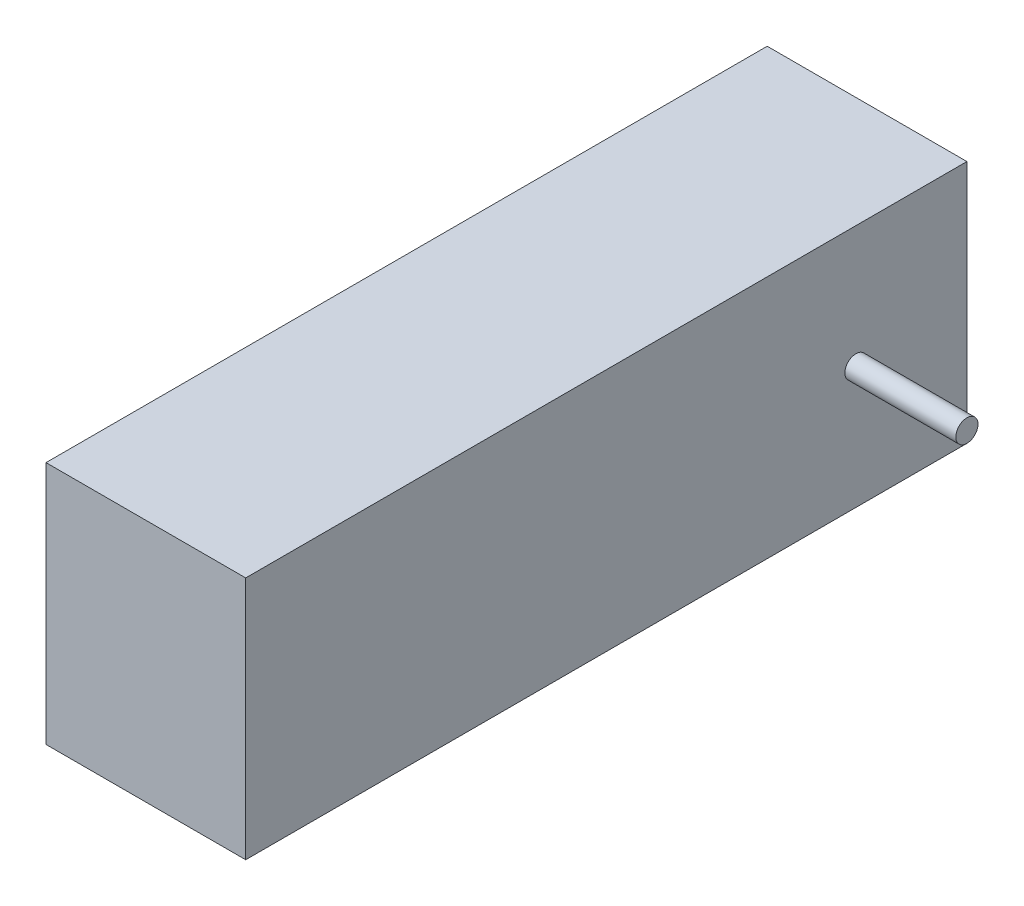
ISO-10303-21;
HEADER;
FILE_DESCRIPTION(('STEP AP214'),'2;1');
FILE_NAME('part.step','',(''),(''),'','','');
FILE_SCHEMA(('AUTOMOTIVE_DESIGN { 1 0 10303 214 1 1 1 1 }'));
ENDSEC;
DATA;
#1=APPLICATION_CONTEXT('core data for automotive mechanical design processes');
#2=APPLICATION_PROTOCOL_DEFINITION('international standard','automotive_design',2000,#1);
#3=PRODUCT_CONTEXT('',#1,'mechanical');
#4=PRODUCT('Part','Part','',(#3));
#5=PRODUCT_RELATED_PRODUCT_CATEGORY('part','',(#4));
#6=PRODUCT_DEFINITION_FORMATION('','',#4);
#7=PRODUCT_DEFINITION_CONTEXT('part definition',#1,'design');
#8=PRODUCT_DEFINITION('design','',#6,#7);
#9=PRODUCT_DEFINITION_SHAPE('','',#8);
#10=(LENGTH_UNIT() NAMED_UNIT(*) SI_UNIT(.MILLI.,.METRE.));
#11=(NAMED_UNIT(*) PLANE_ANGLE_UNIT() SI_UNIT($,.RADIAN.));
#12=(NAMED_UNIT(*) SI_UNIT($,.STERADIAN.) SOLID_ANGLE_UNIT());
#13=UNCERTAINTY_MEASURE_WITH_UNIT(LENGTH_MEASURE(1.E-05),#10,'distance_accuracy_value','');
#14=(GEOMETRIC_REPRESENTATION_CONTEXT(3) GLOBAL_UNCERTAINTY_ASSIGNED_CONTEXT((#13)) GLOBAL_UNIT_ASSIGNED_CONTEXT((#10,
#11,#12)) REPRESENTATION_CONTEXT('',''));
#15=CARTESIAN_POINT('',(0.,0.,0.));
#16=DIRECTION('',(0.,0.,1.));
#17=DIRECTION('',(1.,0.,0.));
#18=AXIS2_PLACEMENT_3D('',#15,#16,#17);
#19=CARTESIAN_POINT('',(-9.,11.,65.));
#20=DIRECTION('',(1.,0.,0.));
#21=DIRECTION('',(0.,1.,0.));
#22=AXIS2_PLACEMENT_3D('',#19,#20,#21);
#23=PLANE('',#22);
#24=CARTESIAN_POINT('',(-9.,0.,10.));
#25=DIRECTION('',(1.,0.,0.));
#26=DIRECTION('',(0.,1.,0.));
#27=AXIS2_PLACEMENT_3D('',#24,#25,#26);
#28=CIRCLE('',#27,1.);
#29=CARTESIAN_POINT('',(-9.,0.999999999999998,10.));
#30=VERTEX_POINT('',#29);
#31=EDGE_CURVE('E100',#30,#30,#28,.T.);
#32=ORIENTED_EDGE('',*,*,#31,.T.);
#33=EDGE_LOOP('',(#32));
#34=FACE_BOUND('',#33,.T.);
#35=DIRECTION('',(0.,-1.,0.));
#36=VECTOR('',#35,1.);
#37=CARTESIAN_POINT('',(-9.,11.,0.));
#38=LINE('',#37,#36);
#39=CARTESIAN_POINT('',(-9.,11.,0.));
#40=VERTEX_POINT('',#39);
#41=CARTESIAN_POINT('',(-8.99999999999999,-11.,0.));
#42=VERTEX_POINT('',#41);
#43=EDGE_CURVE('E97',#40,#42,#38,.T.);
#44=ORIENTED_EDGE('',*,*,#43,.T.);
#45=DIRECTION('',(0.,0.,-1.));
#46=VECTOR('',#45,1.);
#47=CARTESIAN_POINT('',(-8.99999999999999,-11.,65.));
#48=LINE('',#47,#46);
#49=CARTESIAN_POINT('',(-8.99999999999999,-11.,65.));
#50=VERTEX_POINT('',#49);
#51=EDGE_CURVE('E11',#50,#42,#48,.T.);
#52=ORIENTED_EDGE('',*,*,#51,.F.);
#53=DIRECTION('',(0.,-1.,0.));
#54=VECTOR('',#53,1.);
#55=CARTESIAN_POINT('',(-9.,11.,65.));
#56=LINE('',#55,#54);
#57=CARTESIAN_POINT('',(-9.,11.,65.));
#58=VERTEX_POINT('',#57);
#59=EDGE_CURVE('E84',#58,#50,#56,.T.);
#60=ORIENTED_EDGE('',*,*,#59,.F.);
#61=DIRECTION('',(0.,0.,-1.));
#62=VECTOR('',#61,1.);
#63=CARTESIAN_POINT('',(-9.,11.,65.));
#64=LINE('',#63,#62);
#65=EDGE_CURVE('E93',#58,#40,#64,.T.);
#66=ORIENTED_EDGE('',*,*,#65,.T.);
#67=EDGE_LOOP('',(#44,#52,#60,#66));
#68=FACE_BOUND('',#67,.T.);
#69=ADVANCED_FACE('F32',(#34,#68),#23,.F.);
#70=CARTESIAN_POINT('',(9.,-11.,65.));
#71=DIRECTION('',(0.,1.,0.));
#72=DIRECTION('',(-1.,0.,0.));
#73=AXIS2_PLACEMENT_3D('',#70,#71,#72);
#74=PLANE('',#73);
#75=DIRECTION('',(1.,0.,0.));
#76=VECTOR('',#75,1.);
#77=CARTESIAN_POINT('',(9.,-11.,0.));
#78=LINE('',#77,#76);
#79=CARTESIAN_POINT('',(9.,-11.,0.));
#80=VERTEX_POINT('',#79);
#81=EDGE_CURVE('E88',#42,#80,#78,.T.);
#82=ORIENTED_EDGE('',*,*,#81,.T.);
#83=DIRECTION('',(0.,0.,-1.));
#84=VECTOR('',#83,1.);
#85=CARTESIAN_POINT('',(9.,-11.,65.));
#86=LINE('',#85,#84);
#87=CARTESIAN_POINT('',(9.,-11.,65.));
#88=VERTEX_POINT('',#87);
#89=EDGE_CURVE('E41',#88,#80,#86,.T.);
#90=ORIENTED_EDGE('',*,*,#89,.F.);
#91=DIRECTION('',(1.,0.,0.));
#92=VECTOR('',#91,1.);
#93=CARTESIAN_POINT('',(9.,-11.,65.));
#94=LINE('',#93,#92);
#95=EDGE_CURVE('E79',#50,#88,#94,.T.);
#96=ORIENTED_EDGE('',*,*,#95,.F.);
#97=ORIENTED_EDGE('',*,*,#51,.T.);
#98=EDGE_LOOP('',(#82,#90,#96,#97));
#99=FACE_BOUND('',#98,.T.);
#100=ADVANCED_FACE('F87',(#99),#74,.F.);
#101=CARTESIAN_POINT('',(9.,11.,65.));
#102=DIRECTION('',(-1.,0.,0.));
#103=DIRECTION('',(0.,-1.,0.));
#104=AXIS2_PLACEMENT_3D('',#101,#102,#103);
#105=PLANE('',#104);
#106=CARTESIAN_POINT('',(9.,0.,10.));
#107=DIRECTION('',(-1.,0.,0.));
#108=DIRECTION('',(0.,-1.,0.));
#109=AXIS2_PLACEMENT_3D('',#106,#107,#108);
#110=CIRCLE('',#109,1.);
#111=CARTESIAN_POINT('',(9.,-0.999999999999998,10.));
#112=VERTEX_POINT('',#111);
#113=EDGE_CURVE('E35',#112,#112,#110,.T.);
#114=ORIENTED_EDGE('',*,*,#113,.T.);
#115=EDGE_LOOP('',(#114));
#116=FACE_BOUND('',#115,.T.);
#117=DIRECTION('',(0.,1.,0.));
#118=VECTOR('',#117,1.);
#119=CARTESIAN_POINT('',(9.,11.,0.));
#120=LINE('',#119,#118);
#121=CARTESIAN_POINT('',(9.,11.,0.));
#122=VERTEX_POINT('',#121);
#123=EDGE_CURVE('E66',#80,#122,#120,.T.);
#124=ORIENTED_EDGE('',*,*,#123,.T.);
#125=DIRECTION('',(0.,0.,-1.));
#126=VECTOR('',#125,1.);
#127=CARTESIAN_POINT('',(9.,11.,65.));
#128=LINE('',#127,#126);
#129=CARTESIAN_POINT('',(9.,11.,65.));
#130=VERTEX_POINT('',#129);
#131=EDGE_CURVE('E89',#130,#122,#128,.T.);
#132=ORIENTED_EDGE('',*,*,#131,.F.);
#133=DIRECTION('',(0.,1.,0.));
#134=VECTOR('',#133,1.);
#135=CARTESIAN_POINT('',(9.,11.,65.));
#136=LINE('',#135,#134);
#137=EDGE_CURVE('E82',#88,#130,#136,.T.);
#138=ORIENTED_EDGE('',*,*,#137,.F.);
#139=ORIENTED_EDGE('',*,*,#89,.T.);
#140=EDGE_LOOP('',(#124,#132,#138,#139));
#141=FACE_BOUND('',#140,.T.);
#142=ADVANCED_FACE('F91',(#116,#141),#105,.F.);
#143=CARTESIAN_POINT('',(9.,11.,65.));
#144=DIRECTION('',(0.,-1.,0.));
#145=DIRECTION('',(0.,0.,-1.));
#146=AXIS2_PLACEMENT_3D('',#143,#144,#145);
#147=PLANE('',#146);
#148=DIRECTION('',(-1.,0.,0.));
#149=VECTOR('',#148,1.);
#150=CARTESIAN_POINT('',(9.,11.,0.));
#151=LINE('',#150,#149);
#152=EDGE_CURVE('E72',#122,#40,#151,.T.);
#153=ORIENTED_EDGE('',*,*,#152,.T.);
#154=ORIENTED_EDGE('',*,*,#65,.F.);
#155=DIRECTION('',(-1.,0.,0.));
#156=VECTOR('',#155,1.);
#157=CARTESIAN_POINT('',(9.,11.,65.));
#158=LINE('',#157,#156);
#159=EDGE_CURVE('E49',#130,#58,#158,.T.);
#160=ORIENTED_EDGE('',*,*,#159,.F.);
#161=ORIENTED_EDGE('',*,*,#131,.T.);
#162=EDGE_LOOP('',(#153,#154,#160,#161));
#163=FACE_BOUND('',#162,.T.);
#164=ADVANCED_FACE('F105',(#163),#147,.F.);
#165=CARTESIAN_POINT('',(0.,0.,65.));
#166=DIRECTION('',(0.,0.,-1.));
#167=DIRECTION('',(-1.,0.,0.));
#168=AXIS2_PLACEMENT_3D('',#165,#166,#167);
#169=PLANE('',#168);
#170=ORIENTED_EDGE('',*,*,#59,.T.);
#171=ORIENTED_EDGE('',*,*,#95,.T.);
#172=ORIENTED_EDGE('',*,*,#137,.T.);
#173=ORIENTED_EDGE('',*,*,#159,.T.);
#174=EDGE_LOOP('',(#170,#171,#172,#173));
#175=FACE_BOUND('',#174,.T.);
#176=ADVANCED_FACE('F80',(#175),#169,.F.);
#177=CARTESIAN_POINT('',(0.,0.,0.));
#178=DIRECTION('',(0.,0.,-1.));
#179=DIRECTION('',(-1.,0.,0.));
#180=AXIS2_PLACEMENT_3D('',#177,#178,#179);
#181=PLANE('',#180);
#182=ORIENTED_EDGE('',*,*,#43,.F.);
#183=ORIENTED_EDGE('',*,*,#152,.F.);
#184=ORIENTED_EDGE('',*,*,#123,.F.);
#185=ORIENTED_EDGE('',*,*,#81,.F.);
#186=EDGE_LOOP('',(#182,#183,#184,#185));
#187=FACE_BOUND('',#186,.T.);
#188=ADVANCED_FACE('F108',(#187),#181,.T.);
#189=CARTESIAN_POINT('',(19.,0.,10.));
#190=DIRECTION('',(1.,0.,0.));
#191=DIRECTION('',(0.,1.,0.));
#192=AXIS2_PLACEMENT_3D('',#189,#190,#191);
#193=PLANE('',#192);
#194=CARTESIAN_POINT('',(19.,0.,10.));
#195=DIRECTION('',(1.,0.,0.));
#196=DIRECTION('',(0.,1.,0.));
#197=AXIS2_PLACEMENT_3D('',#194,#195,#196);
#198=CIRCLE('',#197,1.);
#199=CARTESIAN_POINT('',(19.,1.,10.));
#200=VERTEX_POINT('',#199);
#201=EDGE_CURVE('E116',#200,#200,#198,.T.);
#202=ORIENTED_EDGE('',*,*,#201,.T.);
#203=EDGE_LOOP('',(#202));
#204=FACE_BOUND('',#203,.T.);
#205=ADVANCED_FACE('F120',(#204),#193,.T.);
#206=CARTESIAN_POINT('',(-19.,0.,10.));
#207=DIRECTION('',(1.,0.,0.));
#208=DIRECTION('',(0.,1.,0.));
#209=AXIS2_PLACEMENT_3D('',#206,#207,#208);
#210=CYLINDRICAL_SURFACE('',#209,1.);
#211=ORIENTED_EDGE('',*,*,#201,.F.);
#212=EDGE_LOOP('',(#211));
#213=FACE_BOUND('',#212,.T.);
#214=ORIENTED_EDGE('',*,*,#113,.F.);
#215=EDGE_LOOP('',(#214));
#216=FACE_BOUND('',#215,.T.);
#217=ADVANCED_FACE('F122',(#213,#216),#210,.T.);
#218=CARTESIAN_POINT('',(-19.,0.,10.));
#219=DIRECTION('',(1.,0.,0.));
#220=DIRECTION('',(0.,1.,0.));
#221=AXIS2_PLACEMENT_3D('',#218,#219,#220);
#222=CIRCLE('',#221,1.);
#223=CARTESIAN_POINT('',(-19.,0.999999999999997,10.));
#224=VERTEX_POINT('',#223);
#225=EDGE_CURVE('E113',#224,#224,#222,.T.);
#226=ORIENTED_EDGE('',*,*,#225,.T.);
#227=EDGE_LOOP('',(#226));
#228=FACE_BOUND('',#227,.T.);
#229=ORIENTED_EDGE('',*,*,#31,.F.);
#230=EDGE_LOOP('',(#229));
#231=FACE_BOUND('',#230,.T.);
#232=ADVANCED_FACE('F125',(#228,#231),#210,.T.);
#233=CARTESIAN_POINT('',(-19.,0.,10.));
#234=DIRECTION('',(1.,0.,0.));
#235=DIRECTION('',(0.,1.,0.));
#236=AXIS2_PLACEMENT_3D('',#233,#234,#235);
#237=PLANE('',#236);
#238=ORIENTED_EDGE('',*,*,#225,.F.);
#239=EDGE_LOOP('',(#238));
#240=FACE_BOUND('',#239,.T.);
#241=ADVANCED_FACE('F144',(#240),#237,.F.);
#242=CLOSED_SHELL('',(#69,#100,#142,#164,#176,#188,#205,#217,#232,#241));
#243=MANIFOLD_SOLID_BREP('B2',#242);
#244=ADVANCED_BREP_SHAPE_REPRESENTATION('',(#18,#243),#14);
#245=SHAPE_DEFINITION_REPRESENTATION(#9,#244);
ENDSEC;
END-ISO-10303-21;
